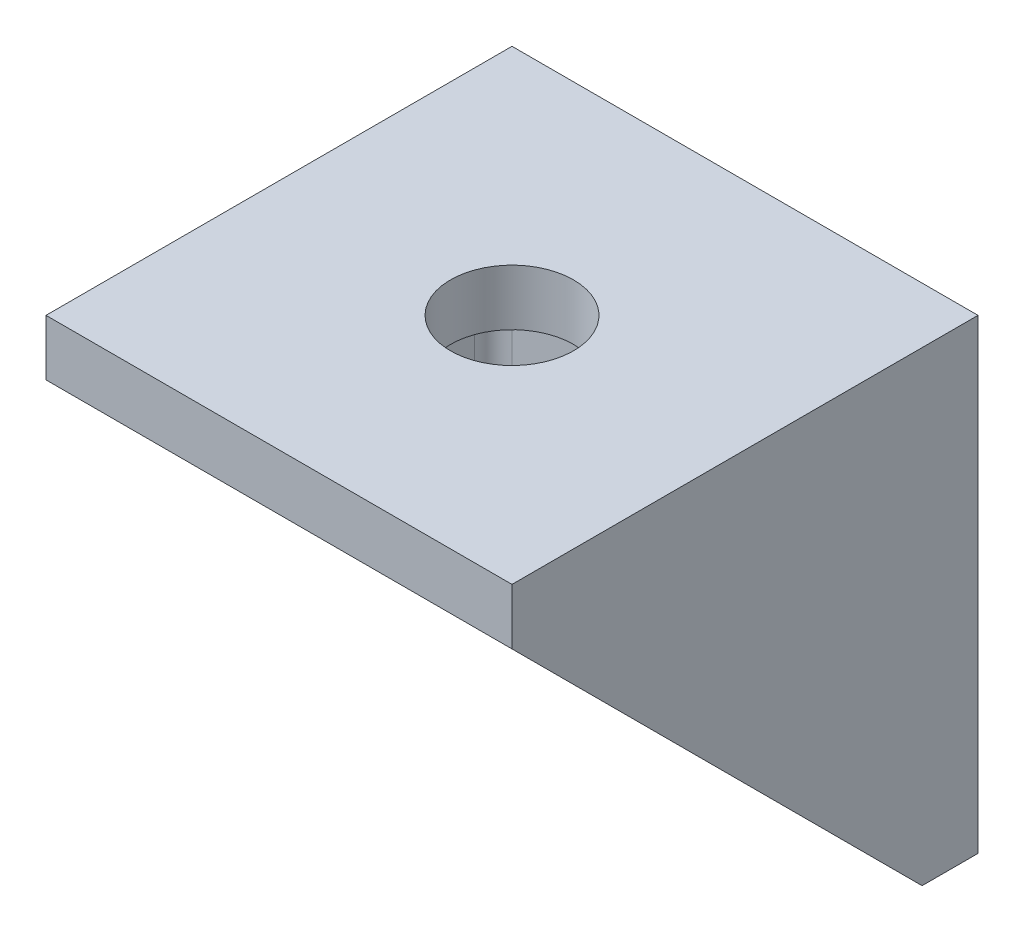
ISO-10303-21;
HEADER;
FILE_DESCRIPTION(('STEP AP214'),'2;1');
FILE_NAME('part.step','',(''),(''),'','','');
FILE_SCHEMA(('AUTOMOTIVE_DESIGN { 1 0 10303 214 1 1 1 1 }'));
ENDSEC;
DATA;
#1=APPLICATION_CONTEXT('core data for automotive mechanical design processes');
#2=APPLICATION_PROTOCOL_DEFINITION('international standard','automotive_design',2000,#1);
#3=PRODUCT_CONTEXT('',#1,'mechanical');
#4=PRODUCT('Part','Part','',(#3));
#5=PRODUCT_RELATED_PRODUCT_CATEGORY('part','',(#4));
#6=PRODUCT_DEFINITION_FORMATION('','',#4);
#7=PRODUCT_DEFINITION_CONTEXT('part definition',#1,'design');
#8=PRODUCT_DEFINITION('design','',#6,#7);
#9=PRODUCT_DEFINITION_SHAPE('','',#8);
#10=(LENGTH_UNIT() NAMED_UNIT(*) SI_UNIT(.MILLI.,.METRE.));
#11=(NAMED_UNIT(*) PLANE_ANGLE_UNIT() SI_UNIT($,.RADIAN.));
#12=(NAMED_UNIT(*) SI_UNIT($,.STERADIAN.) SOLID_ANGLE_UNIT());
#13=UNCERTAINTY_MEASURE_WITH_UNIT(LENGTH_MEASURE(1.E-05),#10,'distance_accuracy_value','');
#14=(GEOMETRIC_REPRESENTATION_CONTEXT(3) GLOBAL_UNCERTAINTY_ASSIGNED_CONTEXT((#13)) GLOBAL_UNIT_ASSIGNED_CONTEXT((#10,
#11,#12)) REPRESENTATION_CONTEXT('',''));
#15=CARTESIAN_POINT('',(0.,0.,0.));
#16=DIRECTION('',(0.,0.,1.));
#17=DIRECTION('',(1.,0.,0.));
#18=AXIS2_PLACEMENT_3D('',#15,#16,#17);
#19=CARTESIAN_POINT('',(0.,0.,3.));
#20=DIRECTION('',(0.,0.,-1.));
#21=DIRECTION('',(-1.,0.,0.));
#22=AXIS2_PLACEMENT_3D('',#19,#20,#21);
#23=PLANE('',#22);
#24=CARTESIAN_POINT('',(0.,0.,3.));
#25=DIRECTION('',(0.,0.,1.));
#26=DIRECTION('',(1.,0.,0.));
#27=AXIS2_PLACEMENT_3D('',#24,#25,#26);
#28=CIRCLE('',#27,3.29999999999999);
#29=CARTESIAN_POINT('',(3.29999999999999,0.,3.));
#30=VERTEX_POINT('',#29);
#31=EDGE_CURVE('E175',#30,#30,#28,.T.);
#32=ORIENTED_EDGE('',*,*,#31,.F.);
#33=EDGE_LOOP('',(#32));
#34=FACE_BOUND('',#33,.T.);
#35=DIRECTION('',(1.,0.,0.));
#36=VECTOR('',#35,1.);
#37=CARTESIAN_POINT('',(-10.5,8.5,3.));
#38=LINE('',#37,#36);
#39=CARTESIAN_POINT('',(9.5,8.5,3.));
#40=VERTEX_POINT('',#39);
#41=CARTESIAN_POINT('',(-9.5,8.5,3.));
#42=VERTEX_POINT('',#41);
#43=EDGE_CURVE('E138',#40,#42,#38,.F.);
#44=ORIENTED_EDGE('',*,*,#43,.T.);
#45=DIRECTION('',(0.,-1.,0.));
#46=VECTOR('',#45,1.);
#47=CARTESIAN_POINT('',(-9.5,0.,3.));
#48=LINE('',#47,#46);
#49=CARTESIAN_POINT('',(-9.5,-12.5,3.));
#50=VERTEX_POINT('',#49);
#51=EDGE_CURVE('E137',#42,#50,#48,.T.);
#52=ORIENTED_EDGE('',*,*,#51,.T.);
#53=DIRECTION('',(1.,0.,0.));
#54=VECTOR('',#53,1.);
#55=CARTESIAN_POINT('',(-12.5,-12.5,3.));
#56=LINE('',#55,#54);
#57=CARTESIAN_POINT('',(9.5,-12.5,3.));
#58=VERTEX_POINT('',#57);
#59=EDGE_CURVE('E215',#50,#58,#56,.T.);
#60=ORIENTED_EDGE('',*,*,#59,.T.);
#61=DIRECTION('',(0.,1.,0.));
#62=VECTOR('',#61,1.);
#63=CARTESIAN_POINT('',(9.5,0.,3.));
#64=LINE('',#63,#62);
#65=EDGE_CURVE('E130',#58,#40,#64,.T.);
#66=ORIENTED_EDGE('',*,*,#65,.T.);
#67=EDGE_LOOP('',(#44,#52,#60,#66));
#68=FACE_BOUND('',#67,.T.);
#69=ADVANCED_FACE('F44',(#34,#68),#23,.F.);
#70=CARTESIAN_POINT('',(12.5,-12.5,3.));
#71=DIRECTION('',(-1.,0.,0.));
#72=DIRECTION('',(0.,0.,1.));
#73=AXIS2_PLACEMENT_3D('',#70,#71,#72);
#74=PLANE('',#73);
#75=DIRECTION('',(0.,1.,0.));
#76=VECTOR('',#75,1.);
#77=CARTESIAN_POINT('',(12.5,-12.5,0.));
#78=LINE('',#77,#76);
#79=CARTESIAN_POINT('',(12.5,-12.5,0.));
#80=VERTEX_POINT('',#79);
#81=CARTESIAN_POINT('',(12.5,12.5,0.));
#82=VERTEX_POINT('',#81);
#83=EDGE_CURVE('E210',#80,#82,#78,.T.);
#84=ORIENTED_EDGE('',*,*,#83,.T.);
#85=DIRECTION('',(0.,0.,-1.));
#86=VECTOR('',#85,1.);
#87=CARTESIAN_POINT('',(12.5,12.5,3.));
#88=LINE('',#87,#86);
#89=CARTESIAN_POINT('',(12.5,12.5,25.));
#90=VERTEX_POINT('',#89);
#91=EDGE_CURVE('E143',#90,#82,#88,.T.);
#92=ORIENTED_EDGE('',*,*,#91,.F.);
#93=DIRECTION('',(0.,1.,0.));
#94=VECTOR('',#93,1.);
#95=CARTESIAN_POINT('',(12.5,12.5,25.));
#96=LINE('',#95,#94);
#97=CARTESIAN_POINT('',(12.5,9.5,25.));
#98=VERTEX_POINT('',#97);
#99=EDGE_CURVE('E204',#98,#90,#96,.T.);
#100=ORIENTED_EDGE('',*,*,#99,.F.);
#101=DIRECTION('',(0.,-0.707106781186548,-0.707106781186548));
#102=VECTOR('',#101,1.);
#103=CARTESIAN_POINT('',(12.5,9.5,25.));
#104=LINE('',#103,#102);
#105=CARTESIAN_POINT('',(12.5,-12.5,3.));
#106=VERTEX_POINT('',#105);
#107=EDGE_CURVE('E126',#98,#106,#104,.T.);
#108=ORIENTED_EDGE('',*,*,#107,.T.);
#109=DIRECTION('',(0.,0.,-1.));
#110=VECTOR('',#109,1.);
#111=CARTESIAN_POINT('',(12.5,-12.5,3.));
#112=LINE('',#111,#110);
#113=EDGE_CURVE('E214',#106,#80,#112,.T.);
#114=ORIENTED_EDGE('',*,*,#113,.T.);
#115=EDGE_LOOP('',(#84,#92,#100,#108,#114));
#116=FACE_BOUND('',#115,.T.);
#117=ADVANCED_FACE('F249',(#116),#74,.F.);
#118=CARTESIAN_POINT('',(-12.5,12.5,3.));
#119=DIRECTION('',(0.,-1.,0.));
#120=DIRECTION('',(0.,0.,-1.));
#121=AXIS2_PLACEMENT_3D('',#118,#119,#120);
#122=PLANE('',#121);
#123=CARTESIAN_POINT('',(0.,12.5,12.5));
#124=DIRECTION('',(0.,-1.,0.));
#125=DIRECTION('',(0.,0.,-1.));
#126=AXIS2_PLACEMENT_3D('',#123,#124,#125);
#127=CIRCLE('',#126,3.29999999999999);
#128=CARTESIAN_POINT('',(0.,12.5,9.20000000000001));
#129=VERTEX_POINT('',#128);
#130=EDGE_CURVE('E187',#129,#129,#127,.T.);
#131=ORIENTED_EDGE('',*,*,#130,.T.);
#132=EDGE_LOOP('',(#131));
#133=FACE_BOUND('',#132,.T.);
#134=DIRECTION('',(-1.,0.,0.));
#135=VECTOR('',#134,1.);
#136=CARTESIAN_POINT('',(-12.5,12.5,0.));
#137=LINE('',#136,#135);
#138=CARTESIAN_POINT('',(-12.5,12.5,0.));
#139=VERTEX_POINT('',#138);
#140=EDGE_CURVE('E218',#82,#139,#137,.T.);
#141=ORIENTED_EDGE('',*,*,#140,.T.);
#142=DIRECTION('',(0.,0.,-1.));
#143=VECTOR('',#142,1.);
#144=CARTESIAN_POINT('',(-12.5,12.5,3.));
#145=LINE('',#144,#143);
#146=CARTESIAN_POINT('',(-12.5,12.5,25.));
#147=VERTEX_POINT('',#146);
#148=EDGE_CURVE('E232',#147,#139,#145,.T.);
#149=ORIENTED_EDGE('',*,*,#148,.F.);
#150=DIRECTION('',(-1.,0.,0.));
#151=VECTOR('',#150,1.);
#152=CARTESIAN_POINT('',(-12.5,12.5,25.));
#153=LINE('',#152,#151);
#154=EDGE_CURVE('E207',#90,#147,#153,.T.);
#155=ORIENTED_EDGE('',*,*,#154,.F.);
#156=ORIENTED_EDGE('',*,*,#91,.T.);
#157=EDGE_LOOP('',(#141,#149,#155,#156));
#158=FACE_BOUND('',#157,.T.);
#159=ADVANCED_FACE('F239',(#133,#158),#122,.F.);
#160=CARTESIAN_POINT('',(-12.5,-12.5,3.));
#161=DIRECTION('',(1.,0.,0.));
#162=DIRECTION('',(0.,0.,-1.));
#163=AXIS2_PLACEMENT_3D('',#160,#161,#162);
#164=PLANE('',#163);
#165=DIRECTION('',(0.,0.,-1.));
#166=VECTOR('',#165,1.);
#167=CARTESIAN_POINT('',(-12.5,-12.5,3.));
#168=LINE('',#167,#166);
#169=CARTESIAN_POINT('',(-12.5,-12.5,3.));
#170=VERTEX_POINT('',#169);
#171=CARTESIAN_POINT('',(-12.5,-12.5,0.));
#172=VERTEX_POINT('',#171);
#173=EDGE_CURVE('E229',#170,#172,#168,.T.);
#174=ORIENTED_EDGE('',*,*,#173,.F.);
#175=DIRECTION('',(0.,0.707106781186548,0.707106781186548));
#176=VECTOR('',#175,1.);
#177=CARTESIAN_POINT('',(-12.5,9.5,25.));
#178=LINE('',#177,#176);
#179=CARTESIAN_POINT('',(-12.5,9.5,25.));
#180=VERTEX_POINT('',#179);
#181=EDGE_CURVE('E190',#170,#180,#178,.T.);
#182=ORIENTED_EDGE('',*,*,#181,.T.);
#183=DIRECTION('',(0.,-1.,0.));
#184=VECTOR('',#183,1.);
#185=CARTESIAN_POINT('',(-12.5,12.5,25.));
#186=LINE('',#185,#184);
#187=EDGE_CURVE('E199',#147,#180,#186,.T.);
#188=ORIENTED_EDGE('',*,*,#187,.F.);
#189=ORIENTED_EDGE('',*,*,#148,.T.);
#190=DIRECTION('',(0.,-1.,0.));
#191=VECTOR('',#190,1.);
#192=CARTESIAN_POINT('',(-12.5,-12.5,0.));
#193=LINE('',#192,#191);
#194=EDGE_CURVE('E221',#139,#172,#193,.T.);
#195=ORIENTED_EDGE('',*,*,#194,.T.);
#196=EDGE_LOOP('',(#174,#182,#188,#189,#195));
#197=FACE_BOUND('',#196,.T.);
#198=ADVANCED_FACE('F286',(#197),#164,.F.);
#199=CARTESIAN_POINT('',(-12.5,-12.5,3.));
#200=DIRECTION('',(0.,1.,0.));
#201=DIRECTION('',(0.,0.,1.));
#202=AXIS2_PLACEMENT_3D('',#199,#200,#201);
#203=PLANE('',#202);
#204=DIRECTION('',(1.,0.,0.));
#205=VECTOR('',#204,1.);
#206=CARTESIAN_POINT('',(-12.5,-12.5,0.));
#207=LINE('',#206,#205);
#208=EDGE_CURVE('E224',#172,#80,#207,.T.);
#209=ORIENTED_EDGE('',*,*,#208,.T.);
#210=ORIENTED_EDGE('',*,*,#113,.F.);
#211=DIRECTION('',(1.,0.,0.));
#212=VECTOR('',#211,1.);
#213=CARTESIAN_POINT('',(10.5,-12.5,3.));
#214=LINE('',#213,#212);
#215=EDGE_CURVE('E61',#58,#106,#214,.T.);
#216=ORIENTED_EDGE('',*,*,#215,.F.);
#217=ORIENTED_EDGE('',*,*,#59,.F.);
#218=EDGE_CURVE('E211',#170,#50,#56,.T.);
#219=ORIENTED_EDGE('',*,*,#218,.F.);
#220=ORIENTED_EDGE('',*,*,#173,.T.);
#221=EDGE_LOOP('',(#209,#210,#216,#217,#219,#220));
#222=FACE_BOUND('',#221,.T.);
#223=ADVANCED_FACE('F295',(#222),#203,.F.);
#224=CARTESIAN_POINT('',(0.,0.,0.));
#225=DIRECTION('',(0.,0.,-1.));
#226=DIRECTION('',(-1.,0.,0.));
#227=AXIS2_PLACEMENT_3D('',#224,#225,#226);
#228=PLANE('',#227);
#229=CARTESIAN_POINT('',(0.,0.,0.));
#230=DIRECTION('',(0.,0.,-1.));
#231=DIRECTION('',(-1.,0.,0.));
#232=AXIS2_PLACEMENT_3D('',#229,#230,#231);
#233=CIRCLE('',#232,3.29999999999999);
#234=CARTESIAN_POINT('',(-3.29999999999999,0.,0.));
#235=VERTEX_POINT('',#234);
#236=EDGE_CURVE('E177',#235,#235,#233,.T.);
#237=ORIENTED_EDGE('',*,*,#236,.F.);
#238=EDGE_LOOP('',(#237));
#239=FACE_BOUND('',#238,.T.);
#240=ORIENTED_EDGE('',*,*,#83,.F.);
#241=ORIENTED_EDGE('',*,*,#208,.F.);
#242=ORIENTED_EDGE('',*,*,#194,.F.);
#243=ORIENTED_EDGE('',*,*,#140,.F.);
#244=EDGE_LOOP('',(#240,#241,#242,#243));
#245=FACE_BOUND('',#244,.T.);
#246=ADVANCED_FACE('F253',(#239,#245),#228,.T.);
#247=CARTESIAN_POINT('',(-12.5,9.5,25.));
#248=DIRECTION('',(0.,1.,0.));
#249=DIRECTION('',(-1.,0.,0.));
#250=AXIS2_PLACEMENT_3D('',#247,#248,#249);
#251=PLANE('',#250);
#252=DIRECTION('',(1.,0.,0.));
#253=VECTOR('',#252,1.);
#254=CARTESIAN_POINT('',(-12.5,9.5,25.));
#255=LINE('',#254,#253);
#256=CARTESIAN_POINT('',(-9.5,9.5,25.));
#257=VERTEX_POINT('',#256);
#258=CARTESIAN_POINT('',(9.5,9.5,25.));
#259=VERTEX_POINT('',#258);
#260=EDGE_CURVE('E202',#257,#259,#255,.T.);
#261=ORIENTED_EDGE('',*,*,#260,.F.);
#262=DIRECTION('',(0.,0.,-1.));
#263=VECTOR('',#262,1.);
#264=CARTESIAN_POINT('',(-9.5,9.5,25.));
#265=LINE('',#264,#263);
#266=CARTESIAN_POINT('',(-9.5,9.5,4.));
#267=VERTEX_POINT('',#266);
#268=EDGE_CURVE('E121',#257,#267,#265,.T.);
#269=ORIENTED_EDGE('',*,*,#268,.T.);
#270=DIRECTION('',(1.,0.,0.));
#271=VECTOR('',#270,1.);
#272=CARTESIAN_POINT('',(10.5,9.5,4.));
#273=LINE('',#272,#271);
#274=CARTESIAN_POINT('',(9.5,9.5,4.));
#275=VERTEX_POINT('',#274);
#276=EDGE_CURVE('E149',#267,#275,#273,.T.);
#277=ORIENTED_EDGE('',*,*,#276,.T.);
#278=DIRECTION('',(0.,0.,1.));
#279=VECTOR('',#278,1.);
#280=CARTESIAN_POINT('',(9.5,9.5,25.));
#281=LINE('',#280,#279);
#282=EDGE_CURVE('E151',#275,#259,#281,.T.);
#283=ORIENTED_EDGE('',*,*,#282,.T.);
#284=EDGE_LOOP('',(#261,#269,#277,#283));
#285=FACE_BOUND('',#284,.T.);
#286=CARTESIAN_POINT('',(0.,9.5,12.5));
#287=DIRECTION('',(0.,-1.,0.));
#288=DIRECTION('',(0.,0.,-1.));
#289=AXIS2_PLACEMENT_3D('',#286,#287,#288);
#290=CIRCLE('',#289,3.29999999999999);
#291=CARTESIAN_POINT('',(0.,9.5,9.20000000000001));
#292=VERTEX_POINT('',#291);
#293=EDGE_CURVE('E182',#292,#292,#290,.T.);
#294=ORIENTED_EDGE('',*,*,#293,.F.);
#295=EDGE_LOOP('',(#294));
#296=FACE_BOUND('',#295,.T.);
#297=ADVANCED_FACE('F302',(#285,#296),#251,.F.);
#298=CARTESIAN_POINT('',(0.,0.,25.));
#299=DIRECTION('',(0.,0.,1.));
#300=DIRECTION('',(1.,0.,0.));
#301=AXIS2_PLACEMENT_3D('',#298,#299,#300);
#302=PLANE('',#301);
#303=ORIENTED_EDGE('',*,*,#187,.T.);
#304=EDGE_CURVE('E70',#180,#257,#255,.T.);
#305=ORIENTED_EDGE('',*,*,#304,.T.);
#306=ORIENTED_EDGE('',*,*,#260,.T.);
#307=DIRECTION('',(1.,0.,0.));
#308=VECTOR('',#307,1.);
#309=CARTESIAN_POINT('',(10.5,9.5,25.));
#310=LINE('',#309,#308);
#311=EDGE_CURVE('E85',#259,#98,#310,.T.);
#312=ORIENTED_EDGE('',*,*,#311,.T.);
#313=ORIENTED_EDGE('',*,*,#99,.T.);
#314=ORIENTED_EDGE('',*,*,#154,.T.);
#315=EDGE_LOOP('',(#303,#305,#306,#312,#313,#314));
#316=FACE_BOUND('',#315,.T.);
#317=ADVANCED_FACE('F287',(#316),#302,.T.);
#318=CARTESIAN_POINT('',(10.5,9.5,25.));
#319=DIRECTION('',(0.,-0.707106781186547,0.707106781186547));
#320=DIRECTION('',(0.,-0.707106781186548,-0.707106781186548));
#321=AXIS2_PLACEMENT_3D('',#318,#319,#320);
#322=PLANE('',#321);
#323=ORIENTED_EDGE('',*,*,#107,.F.);
#324=ORIENTED_EDGE('',*,*,#311,.F.);
#325=CARTESIAN_POINT('',(9.5,8.5,24.));
#326=DIRECTION('',(0.,-0.707106781186547,0.707106781186547));
#327=DIRECTION('',(0.,0.707106781186548,0.707106781186548));
#328=AXIS2_PLACEMENT_3D('',#325,#326,#327);
#329=ELLIPSE('',#328,1.4142135623731,1.);
#330=CARTESIAN_POINT('',(10.5,8.5,24.));
#331=VERTEX_POINT('',#330);
#332=EDGE_CURVE('E53',#259,#331,#329,.F.);
#333=ORIENTED_EDGE('',*,*,#332,.T.);
#334=DIRECTION('',(0.,-0.707106781186548,-0.707106781186548));
#335=VECTOR('',#334,1.);
#336=CARTESIAN_POINT('',(10.5,9.5,25.));
#337=LINE('',#336,#335);
#338=CARTESIAN_POINT('',(10.5,-11.5,4.));
#339=VERTEX_POINT('',#338);
#340=EDGE_CURVE('E114',#331,#339,#337,.T.);
#341=ORIENTED_EDGE('',*,*,#340,.T.);
#342=CARTESIAN_POINT('',(9.5,-11.5,4.));
#343=DIRECTION('',(0.,-0.707106781186547,0.707106781186547));
#344=DIRECTION('',(0.,0.707106781186548,0.707106781186548));
#345=AXIS2_PLACEMENT_3D('',#342,#343,#344);
#346=ELLIPSE('',#345,1.4142135623731,1.);
#347=EDGE_CURVE('E13',#339,#58,#346,.F.);
#348=ORIENTED_EDGE('',*,*,#347,.T.);
#349=ORIENTED_EDGE('',*,*,#215,.T.);
#350=EDGE_LOOP('',(#323,#324,#333,#341,#348,#349));
#351=FACE_BOUND('',#350,.T.);
#352=ADVANCED_FACE('F123',(#351),#322,.T.);
#353=CARTESIAN_POINT('',(10.5,0.,0.));
#354=DIRECTION('',(-1.,0.,0.));
#355=DIRECTION('',(0.,0.,1.));
#356=AXIS2_PLACEMENT_3D('',#353,#354,#355);
#357=PLANE('',#356);
#358=ORIENTED_EDGE('',*,*,#340,.F.);
#359=DIRECTION('',(0.,0.,1.));
#360=VECTOR('',#359,1.);
#361=CARTESIAN_POINT('',(10.5,8.5,0.));
#362=LINE('',#361,#360);
#363=CARTESIAN_POINT('',(10.5,8.5,4.));
#364=VERTEX_POINT('',#363);
#365=EDGE_CURVE('E116',#331,#364,#362,.F.);
#366=ORIENTED_EDGE('',*,*,#365,.T.);
#367=DIRECTION('',(0.,1.,0.));
#368=VECTOR('',#367,1.);
#369=CARTESIAN_POINT('',(10.5,0.,4.));
#370=LINE('',#369,#368);
#371=EDGE_CURVE('E111',#364,#339,#370,.F.);
#372=ORIENTED_EDGE('',*,*,#371,.T.);
#373=EDGE_LOOP('',(#358,#366,#372));
#374=FACE_BOUND('',#373,.T.);
#375=ADVANCED_FACE('F113',(#374),#357,.T.);
#376=CARTESIAN_POINT('',(-10.5,9.5,25.));
#377=DIRECTION('',(0.,-0.707106781186547,0.707106781186547));
#378=DIRECTION('',(0.,-0.707106781186548,-0.707106781186548));
#379=AXIS2_PLACEMENT_3D('',#376,#377,#378);
#380=PLANE('',#379);
#381=ORIENTED_EDGE('',*,*,#181,.F.);
#382=ORIENTED_EDGE('',*,*,#218,.T.);
#383=CARTESIAN_POINT('',(-9.5,-11.5,4.));
#384=DIRECTION('',(0.,-0.707106781186547,0.707106781186547));
#385=DIRECTION('',(0.,-0.707106781186548,-0.707106781186548));
#386=AXIS2_PLACEMENT_3D('',#383,#384,#385);
#387=ELLIPSE('',#386,1.4142135623731,1.);
#388=CARTESIAN_POINT('',(-10.5,-11.5,4.));
#389=VERTEX_POINT('',#388);
#390=EDGE_CURVE('E155',#50,#389,#387,.F.);
#391=ORIENTED_EDGE('',*,*,#390,.T.);
#392=DIRECTION('',(0.,0.707106781186548,0.707106781186548));
#393=VECTOR('',#392,1.);
#394=CARTESIAN_POINT('',(-10.5,9.5,25.));
#395=LINE('',#394,#393);
#396=CARTESIAN_POINT('',(-10.5,8.5,24.));
#397=VERTEX_POINT('',#396);
#398=EDGE_CURVE('E191',#389,#397,#395,.T.);
#399=ORIENTED_EDGE('',*,*,#398,.T.);
#400=CARTESIAN_POINT('',(-9.5,8.5,24.));
#401=DIRECTION('',(0.,-0.707106781186547,0.707106781186547));
#402=DIRECTION('',(0.,-0.707106781186548,-0.707106781186548));
#403=AXIS2_PLACEMENT_3D('',#400,#401,#402);
#404=ELLIPSE('',#403,1.4142135623731,1.);
#405=EDGE_CURVE('E158',#397,#257,#404,.F.);
#406=ORIENTED_EDGE('',*,*,#405,.T.);
#407=ORIENTED_EDGE('',*,*,#304,.F.);
#408=EDGE_LOOP('',(#381,#382,#391,#399,#406,#407));
#409=FACE_BOUND('',#408,.T.);
#410=ADVANCED_FACE('F265',(#409),#380,.T.);
#411=CARTESIAN_POINT('',(-10.5,0.,0.));
#412=DIRECTION('',(1.,0.,0.));
#413=DIRECTION('',(0.,0.,-1.));
#414=AXIS2_PLACEMENT_3D('',#411,#412,#413);
#415=PLANE('',#414);
#416=ORIENTED_EDGE('',*,*,#398,.F.);
#417=DIRECTION('',(0.,-1.,0.));
#418=VECTOR('',#417,1.);
#419=CARTESIAN_POINT('',(-10.5,0.,4.));
#420=LINE('',#419,#418);
#421=CARTESIAN_POINT('',(-10.5,8.5,4.));
#422=VERTEX_POINT('',#421);
#423=EDGE_CURVE('E97',#389,#422,#420,.F.);
#424=ORIENTED_EDGE('',*,*,#423,.T.);
#425=DIRECTION('',(0.,0.,-1.));
#426=VECTOR('',#425,1.);
#427=CARTESIAN_POINT('',(-10.5,8.5,0.));
#428=LINE('',#427,#426);
#429=EDGE_CURVE('E141',#422,#397,#428,.F.);
#430=ORIENTED_EDGE('',*,*,#429,.T.);
#431=EDGE_LOOP('',(#416,#424,#430));
#432=FACE_BOUND('',#431,.T.);
#433=ADVANCED_FACE('F270',(#432),#415,.T.);
#434=CARTESIAN_POINT('',(0.,9.5,12.5));
#435=DIRECTION('',(0.,-1.,0.));
#436=DIRECTION('',(0.,0.,-1.));
#437=AXIS2_PLACEMENT_3D('',#434,#435,#436);
#438=CYLINDRICAL_SURFACE('',#437,3.29999999999999);
#439=ORIENTED_EDGE('',*,*,#130,.F.);
#440=EDGE_LOOP('',(#439));
#441=FACE_BOUND('',#440,.T.);
#442=ORIENTED_EDGE('',*,*,#293,.T.);
#443=EDGE_LOOP('',(#442));
#444=FACE_BOUND('',#443,.T.);
#445=ADVANCED_FACE('F327',(#441,#444),#438,.F.);
#446=CARTESIAN_POINT('',(0.,0.,3.));
#447=DIRECTION('',(0.,0.,1.));
#448=DIRECTION('',(1.,0.,0.));
#449=AXIS2_PLACEMENT_3D('',#446,#447,#448);
#450=CYLINDRICAL_SURFACE('',#449,3.29999999999999);
#451=ORIENTED_EDGE('',*,*,#31,.T.);
#452=EDGE_LOOP('',(#451));
#453=FACE_BOUND('',#452,.T.);
#454=ORIENTED_EDGE('',*,*,#236,.T.);
#455=EDGE_LOOP('',(#454));
#456=FACE_BOUND('',#455,.T.);
#457=ADVANCED_FACE('F330',(#453,#456),#450,.F.);
#458=CARTESIAN_POINT('',(9.5,8.5,25.));
#459=DIRECTION('',(0.,0.,1.));
#460=DIRECTION('',(1.,0.,0.));
#461=AXIS2_PLACEMENT_3D('',#458,#459,#460);
#462=CYLINDRICAL_SURFACE('',#461,1.);
#463=ORIENTED_EDGE('',*,*,#332,.F.);
#464=ORIENTED_EDGE('',*,*,#282,.F.);
#465=CARTESIAN_POINT('',(9.5,8.5,4.));
#466=DIRECTION('',(0.,0.,1.));
#467=DIRECTION('',(1.,0.,0.));
#468=AXIS2_PLACEMENT_3D('',#465,#466,#467);
#469=CIRCLE('',#468,1.);
#470=EDGE_CURVE('E48',#364,#275,#469,.T.);
#471=ORIENTED_EDGE('',*,*,#470,.F.);
#472=ORIENTED_EDGE('',*,*,#365,.F.);
#473=EDGE_LOOP('',(#463,#464,#471,#472));
#474=FACE_BOUND('',#473,.T.);
#475=ADVANCED_FACE('F46',(#474),#462,.F.);
#476=CARTESIAN_POINT('',(9.5,0.,4.));
#477=DIRECTION('',(0.,1.,0.));
#478=DIRECTION('',(0.,0.,1.));
#479=AXIS2_PLACEMENT_3D('',#476,#477,#478);
#480=CYLINDRICAL_SURFACE('',#479,1.);
#481=ORIENTED_EDGE('',*,*,#347,.F.);
#482=ORIENTED_EDGE('',*,*,#371,.F.);
#483=CARTESIAN_POINT('',(9.5,8.5,4.));
#484=DIRECTION('',(0.,-1.,0.));
#485=DIRECTION('',(0.,0.,-1.));
#486=AXIS2_PLACEMENT_3D('',#483,#484,#485);
#487=CIRCLE('',#486,1.);
#488=EDGE_CURVE('E133',#40,#364,#487,.T.);
#489=ORIENTED_EDGE('',*,*,#488,.F.);
#490=ORIENTED_EDGE('',*,*,#65,.F.);
#491=EDGE_LOOP('',(#481,#482,#489,#490));
#492=FACE_BOUND('',#491,.T.);
#493=ADVANCED_FACE('F128',(#492),#480,.F.);
#494=CARTESIAN_POINT('',(9.5,8.5,4.));
#495=DIRECTION('',(0.,0.,1.));
#496=DIRECTION('',(1.,0.,0.));
#497=AXIS2_PLACEMENT_3D('',#494,#495,#496);
#498=SPHERICAL_SURFACE('',#497,1.);
#499=ORIENTED_EDGE('',*,*,#488,.T.);
#500=ORIENTED_EDGE('',*,*,#470,.T.);
#501=CARTESIAN_POINT('',(9.5,8.5,4.));
#502=DIRECTION('',(-1.,0.,0.));
#503=DIRECTION('',(0.,0.,1.));
#504=AXIS2_PLACEMENT_3D('',#501,#502,#503);
#505=CIRCLE('',#504,1.);
#506=EDGE_CURVE('E171',#40,#275,#505,.F.);
#507=ORIENTED_EDGE('',*,*,#506,.F.);
#508=EDGE_LOOP('',(#499,#500,#507));
#509=FACE_BOUND('',#508,.T.);
#510=ADVANCED_FACE('F342',(#509),#498,.F.);
#511=CARTESIAN_POINT('',(-9.5,8.5,25.));
#512=DIRECTION('',(0.,0.,-1.));
#513=DIRECTION('',(-1.,0.,0.));
#514=AXIS2_PLACEMENT_3D('',#511,#512,#513);
#515=CYLINDRICAL_SURFACE('',#514,1.);
#516=ORIENTED_EDGE('',*,*,#405,.F.);
#517=ORIENTED_EDGE('',*,*,#429,.F.);
#518=CARTESIAN_POINT('',(-9.5,8.5,4.));
#519=DIRECTION('',(0.,0.,1.));
#520=DIRECTION('',(1.,0.,0.));
#521=AXIS2_PLACEMENT_3D('',#518,#519,#520);
#522=CIRCLE('',#521,1.);
#523=EDGE_CURVE('E168',#267,#422,#522,.T.);
#524=ORIENTED_EDGE('',*,*,#523,.F.);
#525=ORIENTED_EDGE('',*,*,#268,.F.);
#526=EDGE_LOOP('',(#516,#517,#524,#525));
#527=FACE_BOUND('',#526,.T.);
#528=ADVANCED_FACE('F279',(#527),#515,.F.);
#529=CARTESIAN_POINT('',(-12.5,8.5,4.));
#530=DIRECTION('',(-1.,0.,0.));
#531=DIRECTION('',(0.,-1.,0.));
#532=AXIS2_PLACEMENT_3D('',#529,#530,#531);
#533=CYLINDRICAL_SURFACE('',#532,1.);
#534=ORIENTED_EDGE('',*,*,#506,.T.);
#535=ORIENTED_EDGE('',*,*,#276,.F.);
#536=CARTESIAN_POINT('',(-9.5,8.5,4.));
#537=DIRECTION('',(1.,0.,0.));
#538=DIRECTION('',(0.,0.,-1.));
#539=AXIS2_PLACEMENT_3D('',#536,#537,#538);
#540=CIRCLE('',#539,1.);
#541=EDGE_CURVE('E165',#42,#267,#540,.T.);
#542=ORIENTED_EDGE('',*,*,#541,.F.);
#543=ORIENTED_EDGE('',*,*,#43,.F.);
#544=EDGE_LOOP('',(#534,#535,#542,#543));
#545=FACE_BOUND('',#544,.T.);
#546=ADVANCED_FACE('F347',(#545),#533,.F.);
#547=CARTESIAN_POINT('',(-9.5,8.5,4.));
#548=DIRECTION('',(0.,0.,1.));
#549=DIRECTION('',(1.,0.,0.));
#550=AXIS2_PLACEMENT_3D('',#547,#548,#549);
#551=SPHERICAL_SURFACE('',#550,1.);
#552=ORIENTED_EDGE('',*,*,#541,.T.);
#553=ORIENTED_EDGE('',*,*,#523,.T.);
#554=CARTESIAN_POINT('',(-9.5,8.5,4.));
#555=DIRECTION('',(0.,-1.,0.));
#556=DIRECTION('',(0.,0.,-1.));
#557=AXIS2_PLACEMENT_3D('',#554,#555,#556);
#558=CIRCLE('',#557,1.);
#559=EDGE_CURVE('E162',#42,#422,#558,.F.);
#560=ORIENTED_EDGE('',*,*,#559,.F.);
#561=EDGE_LOOP('',(#552,#553,#560));
#562=FACE_BOUND('',#561,.T.);
#563=ADVANCED_FACE('F274',(#562),#551,.F.);
#564=CARTESIAN_POINT('',(-9.5,0.,4.));
#565=DIRECTION('',(0.,-1.,0.));
#566=DIRECTION('',(0.,0.,-1.));
#567=AXIS2_PLACEMENT_3D('',#564,#565,#566);
#568=CYLINDRICAL_SURFACE('',#567,1.);
#569=ORIENTED_EDGE('',*,*,#559,.T.);
#570=ORIENTED_EDGE('',*,*,#423,.F.);
#571=ORIENTED_EDGE('',*,*,#390,.F.);
#572=ORIENTED_EDGE('',*,*,#51,.F.);
#573=EDGE_LOOP('',(#569,#570,#571,#572));
#574=FACE_BOUND('',#573,.T.);
#575=ADVANCED_FACE('F271',(#574),#568,.F.);
#576=CLOSED_SHELL('',(#69,#117,#159,#198,#223,#246,#297,#317,#352,#375,#410,#433,#445,#457,#475,
#493,#510,#528,#546,#563,#575));
#577=MANIFOLD_SOLID_BREP('B2',#576);
#578=ADVANCED_BREP_SHAPE_REPRESENTATION('',(#18,#577),#14);
#579=SHAPE_DEFINITION_REPRESENTATION(#9,#578);
ENDSEC;
END-ISO-10303-21;
